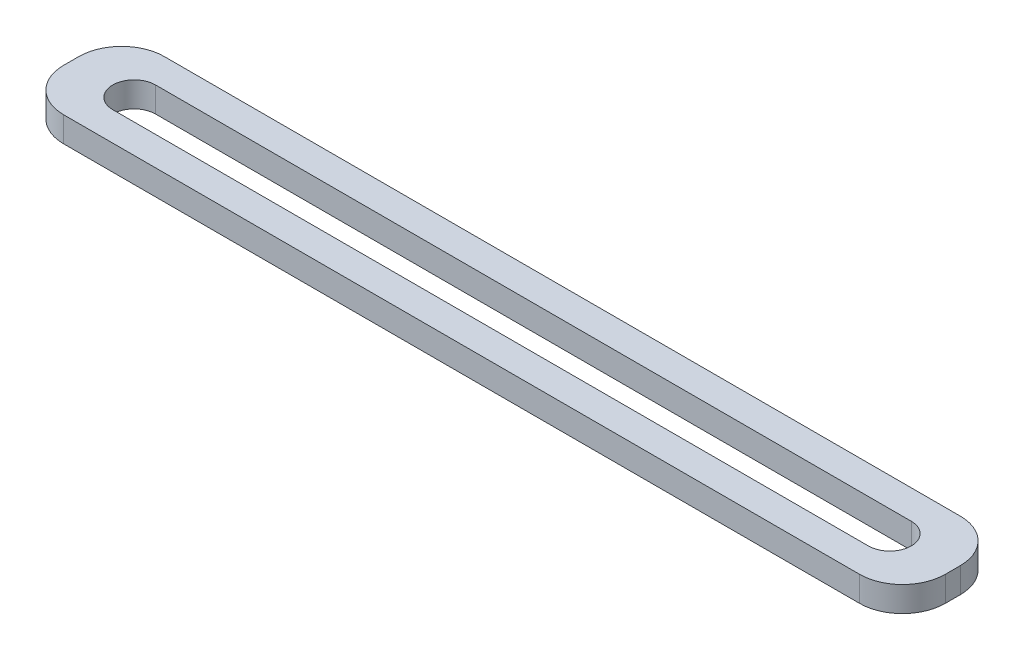
ISO-10303-21;
HEADER;
FILE_DESCRIPTION(('STEP AP214'),'2;1');
FILE_NAME('part.step','',(''),(''),'','','');
FILE_SCHEMA(('AUTOMOTIVE_DESIGN { 1 0 10303 214 1 1 1 1 }'));
ENDSEC;
DATA;
#1=APPLICATION_CONTEXT('core data for automotive mechanical design processes');
#2=APPLICATION_PROTOCOL_DEFINITION('international standard','automotive_design',2000,#1);
#3=PRODUCT_CONTEXT('',#1,'mechanical');
#4=PRODUCT('Part','Part','',(#3));
#5=PRODUCT_RELATED_PRODUCT_CATEGORY('part','',(#4));
#6=PRODUCT_DEFINITION_FORMATION('','',#4);
#7=PRODUCT_DEFINITION_CONTEXT('part definition',#1,'design');
#8=PRODUCT_DEFINITION('design','',#6,#7);
#9=PRODUCT_DEFINITION_SHAPE('','',#8);
#10=(LENGTH_UNIT() NAMED_UNIT(*) SI_UNIT(.MILLI.,.METRE.));
#11=(NAMED_UNIT(*) PLANE_ANGLE_UNIT() SI_UNIT($,.RADIAN.));
#12=(NAMED_UNIT(*) SI_UNIT($,.STERADIAN.) SOLID_ANGLE_UNIT());
#13=UNCERTAINTY_MEASURE_WITH_UNIT(LENGTH_MEASURE(1.E-05),#10,'distance_accuracy_value','');
#14=(GEOMETRIC_REPRESENTATION_CONTEXT(3) GLOBAL_UNCERTAINTY_ASSIGNED_CONTEXT((#13)) GLOBAL_UNIT_ASSIGNED_CONTEXT((#10,
#11,#12)) REPRESENTATION_CONTEXT('',''));
#15=CARTESIAN_POINT('',(0.,0.,0.));
#16=DIRECTION('',(0.,0.,1.));
#17=DIRECTION('',(1.,0.,0.));
#18=AXIS2_PLACEMENT_3D('',#15,#16,#17);
#19=CARTESIAN_POINT('',(35.,2.,1.21430643318376E-13));
#20=DIRECTION('',(1.,0.,0.));
#21=DIRECTION('',(0.,0.,-1.));
#22=AXIS2_PLACEMENT_3D('',#19,#20,#21);
#23=PLANE('',#22);
#24=DIRECTION('',(0.,0.,1.));
#25=VECTOR('',#24,1.);
#26=CARTESIAN_POINT('',(35.,2.,1.21430643318376E-13));
#27=LINE('',#26,#25);
#28=CARTESIAN_POINT('',(35.,2.,-0.599999999999991));
#29=VERTEX_POINT('',#28);
#30=CARTESIAN_POINT('',(35.,2.,0.600000000000012));
#31=VERTEX_POINT('',#30);
#32=EDGE_CURVE('E174',#29,#31,#27,.T.);
#33=ORIENTED_EDGE('',*,*,#32,.T.);
#34=DIRECTION('',(0.,-1.,0.));
#35=VECTOR('',#34,1.);
#36=CARTESIAN_POINT('',(35.,0.,0.600000000000012));
#37=LINE('',#36,#35);
#38=CARTESIAN_POINT('',(35.,0.,0.600000000000012));
#39=VERTEX_POINT('',#38);
#40=EDGE_CURVE('E222',#31,#39,#37,.T.);
#41=ORIENTED_EDGE('',*,*,#40,.T.);
#42=DIRECTION('',(0.,0.,1.));
#43=VECTOR('',#42,1.);
#44=CARTESIAN_POINT('',(35.,0.,1.21430643318376E-13));
#45=LINE('',#44,#43);
#46=CARTESIAN_POINT('',(35.,0.,-0.599999999999991));
#47=VERTEX_POINT('',#46);
#48=EDGE_CURVE('E203',#47,#39,#45,.T.);
#49=ORIENTED_EDGE('',*,*,#48,.F.);
#50=DIRECTION('',(0.,-1.,0.));
#51=VECTOR('',#50,1.);
#52=CARTESIAN_POINT('',(35.,2.,-0.599999999999991));
#53=LINE('',#52,#51);
#54=EDGE_CURVE('E147',#47,#29,#53,.F.);
#55=ORIENTED_EDGE('',*,*,#54,.T.);
#56=EDGE_LOOP('',(#33,#41,#49,#55));
#57=FACE_BOUND('',#56,.T.);
#58=ADVANCED_FACE('F45',(#57),#23,.T.);
#59=CARTESIAN_POINT('',(0.,2.,-4.));
#60=DIRECTION('',(0.,0.,-1.));
#61=DIRECTION('',(-1.,0.,0.));
#62=AXIS2_PLACEMENT_3D('',#59,#60,#61);
#63=PLANE('',#62);
#64=DIRECTION('',(1.,0.,0.));
#65=VECTOR('',#64,1.);
#66=CARTESIAN_POINT('',(0.,2.,-4.));
#67=LINE('',#66,#65);
#68=CARTESIAN_POINT('',(-31.6,2.,-3.99999999999999));
#69=VERTEX_POINT('',#68);
#70=CARTESIAN_POINT('',(31.6,2.,-4.));
#71=VERTEX_POINT('',#70);
#72=EDGE_CURVE('E178',#69,#71,#67,.T.);
#73=ORIENTED_EDGE('',*,*,#72,.T.);
#74=DIRECTION('',(0.,-1.,0.));
#75=VECTOR('',#74,1.);
#76=CARTESIAN_POINT('',(31.6,2.,-4.));
#77=LINE('',#76,#75);
#78=CARTESIAN_POINT('',(31.6,0.,-4.));
#79=VERTEX_POINT('',#78);
#80=EDGE_CURVE('E259',#71,#79,#77,.T.);
#81=ORIENTED_EDGE('',*,*,#80,.T.);
#82=DIRECTION('',(1.,0.,0.));
#83=VECTOR('',#82,1.);
#84=CARTESIAN_POINT('',(0.,0.,-4.));
#85=LINE('',#84,#83);
#86=CARTESIAN_POINT('',(-31.6,0.,-3.99999999999999));
#87=VERTEX_POINT('',#86);
#88=EDGE_CURVE('E207',#87,#79,#85,.T.);
#89=ORIENTED_EDGE('',*,*,#88,.F.);
#90=DIRECTION('',(0.,-1.,0.));
#91=VECTOR('',#90,1.);
#92=CARTESIAN_POINT('',(-31.6,2.,-3.99999999999999));
#93=LINE('',#92,#91);
#94=EDGE_CURVE('E256',#87,#69,#93,.F.);
#95=ORIENTED_EDGE('',*,*,#94,.T.);
#96=EDGE_LOOP('',(#73,#81,#89,#95));
#97=FACE_BOUND('',#96,.T.);
#98=ADVANCED_FACE('F293',(#97),#63,.T.);
#99=CARTESIAN_POINT('',(-35.,2.,0.));
#100=DIRECTION('',(1.,0.,0.));
#101=DIRECTION('',(0.,0.,-1.));
#102=AXIS2_PLACEMENT_3D('',#99,#100,#101);
#103=PLANE('',#102);
#104=DIRECTION('',(0.,0.,1.));
#105=VECTOR('',#104,1.);
#106=CARTESIAN_POINT('',(-35.,0.,0.));
#107=LINE('',#106,#105);
#108=CARTESIAN_POINT('',(-35.,0.,-0.599999999999994));
#109=VERTEX_POINT('',#108);
#110=CARTESIAN_POINT('',(-35.,0.,0.600000000000005));
#111=VERTEX_POINT('',#110);
#112=EDGE_CURVE('E167',#109,#111,#107,.T.);
#113=ORIENTED_EDGE('',*,*,#112,.T.);
#114=DIRECTION('',(0.,-1.,0.));
#115=VECTOR('',#114,1.);
#116=CARTESIAN_POINT('',(-35.,2.,0.600000000000005));
#117=LINE('',#116,#115);
#118=CARTESIAN_POINT('',(-35.,2.,0.600000000000005));
#119=VERTEX_POINT('',#118);
#120=EDGE_CURVE('E11',#111,#119,#117,.F.);
#121=ORIENTED_EDGE('',*,*,#120,.T.);
#122=DIRECTION('',(0.,0.,1.));
#123=VECTOR('',#122,1.);
#124=CARTESIAN_POINT('',(-35.,2.,0.));
#125=LINE('',#124,#123);
#126=CARTESIAN_POINT('',(-35.,2.,-0.599999999999994));
#127=VERTEX_POINT('',#126);
#128=EDGE_CURVE('E182',#127,#119,#125,.T.);
#129=ORIENTED_EDGE('',*,*,#128,.F.);
#130=DIRECTION('',(0.,-1.,0.));
#131=VECTOR('',#130,1.);
#132=CARTESIAN_POINT('',(-35.,0.,-0.599999999999994));
#133=LINE('',#132,#131);
#134=EDGE_CURVE('E54',#127,#109,#133,.T.);
#135=ORIENTED_EDGE('',*,*,#134,.T.);
#136=EDGE_LOOP('',(#113,#121,#129,#135));
#137=FACE_BOUND('',#136,.T.);
#138=ADVANCED_FACE('F266',(#137),#103,.F.);
#139=CARTESIAN_POINT('',(-30.,2.,0.));
#140=DIRECTION('',(0.,-1.,0.));
#141=DIRECTION('',(0.,0.,-1.));
#142=AXIS2_PLACEMENT_3D('',#139,#140,#141);
#143=CYLINDRICAL_SURFACE('',#142,1.7);
#144=CARTESIAN_POINT('',(-30.,0.,0.));
#145=DIRECTION('',(0.,1.,0.));
#146=DIRECTION('',(0.,0.,1.));
#147=AXIS2_PLACEMENT_3D('',#144,#145,#146);
#148=CIRCLE('',#147,1.7);
#149=CARTESIAN_POINT('',(-30.,0.,-1.7));
#150=VERTEX_POINT('',#149);
#151=CARTESIAN_POINT('',(-30.,0.,1.7));
#152=VERTEX_POINT('',#151);
#153=EDGE_CURVE('E142',#150,#152,#148,.T.);
#154=ORIENTED_EDGE('',*,*,#153,.F.);
#155=DIRECTION('',(0.,-1.,0.));
#156=VECTOR('',#155,1.);
#157=CARTESIAN_POINT('',(-30.,2.,-1.7));
#158=LINE('',#157,#156);
#159=CARTESIAN_POINT('',(-30.,2.,-1.7));
#160=VERTEX_POINT('',#159);
#161=EDGE_CURVE('E135',#160,#150,#158,.T.);
#162=ORIENTED_EDGE('',*,*,#161,.F.);
#163=CARTESIAN_POINT('',(-30.,2.,0.));
#164=DIRECTION('',(0.,1.,0.));
#165=DIRECTION('',(0.,0.,1.));
#166=AXIS2_PLACEMENT_3D('',#163,#164,#165);
#167=CIRCLE('',#166,1.7);
#168=CARTESIAN_POINT('',(-30.,2.,1.7));
#169=VERTEX_POINT('',#168);
#170=EDGE_CURVE('E139',#160,#169,#167,.T.);
#171=ORIENTED_EDGE('',*,*,#170,.T.);
#172=DIRECTION('',(0.,-1.,0.));
#173=VECTOR('',#172,1.);
#174=CARTESIAN_POINT('',(-30.,2.,1.7));
#175=LINE('',#174,#173);
#176=EDGE_CURVE('E189',#169,#152,#175,.T.);
#177=ORIENTED_EDGE('',*,*,#176,.T.);
#178=EDGE_LOOP('',(#154,#162,#171,#177));
#179=FACE_BOUND('',#178,.T.);
#180=ADVANCED_FACE('F137',(#179),#143,.F.);
#181=CARTESIAN_POINT('',(0.,2.,-1.7));
#182=DIRECTION('',(0.,0.,-1.));
#183=DIRECTION('',(-1.,0.,0.));
#184=AXIS2_PLACEMENT_3D('',#181,#182,#183);
#185=PLANE('',#184);
#186=DIRECTION('',(1.,0.,0.));
#187=VECTOR('',#186,1.);
#188=CARTESIAN_POINT('',(0.,0.,-1.7));
#189=LINE('',#188,#187);
#190=CARTESIAN_POINT('',(30.,0.,-1.7));
#191=VERTEX_POINT('',#190);
#192=EDGE_CURVE('E192',#150,#191,#189,.T.);
#193=ORIENTED_EDGE('',*,*,#192,.T.);
#194=DIRECTION('',(0.,-1.,0.));
#195=VECTOR('',#194,1.);
#196=CARTESIAN_POINT('',(30.,2.,-1.7));
#197=LINE('',#196,#195);
#198=CARTESIAN_POINT('',(30.,2.,-1.7));
#199=VERTEX_POINT('',#198);
#200=EDGE_CURVE('E148',#199,#191,#197,.T.);
#201=ORIENTED_EDGE('',*,*,#200,.F.);
#202=DIRECTION('',(1.,0.,0.));
#203=VECTOR('',#202,1.);
#204=CARTESIAN_POINT('',(0.,2.,-1.7));
#205=LINE('',#204,#203);
#206=EDGE_CURVE('E151',#160,#199,#205,.T.);
#207=ORIENTED_EDGE('',*,*,#206,.F.);
#208=ORIENTED_EDGE('',*,*,#161,.T.);
#209=EDGE_LOOP('',(#193,#201,#207,#208));
#210=FACE_BOUND('',#209,.T.);
#211=ADVANCED_FACE('F152',(#210),#185,.F.);
#212=CARTESIAN_POINT('',(30.,2.,0.));
#213=DIRECTION('',(0.,-1.,0.));
#214=DIRECTION('',(0.,0.,-1.));
#215=AXIS2_PLACEMENT_3D('',#212,#213,#214);
#216=CYLINDRICAL_SURFACE('',#215,1.70000000000001);
#217=CARTESIAN_POINT('',(30.,0.,0.));
#218=DIRECTION('',(0.,1.,0.));
#219=DIRECTION('',(0.,0.,1.));
#220=AXIS2_PLACEMENT_3D('',#217,#218,#219);
#221=CIRCLE('',#220,1.70000000000001);
#222=CARTESIAN_POINT('',(30.,0.,1.7));
#223=VERTEX_POINT('',#222);
#224=EDGE_CURVE('E195',#223,#191,#221,.T.);
#225=ORIENTED_EDGE('',*,*,#224,.F.);
#226=DIRECTION('',(0.,-1.,0.));
#227=VECTOR('',#226,1.);
#228=CARTESIAN_POINT('',(30.,2.,1.7));
#229=LINE('',#228,#227);
#230=CARTESIAN_POINT('',(30.,2.,1.7));
#231=VERTEX_POINT('',#230);
#232=EDGE_CURVE('E215',#231,#223,#229,.T.);
#233=ORIENTED_EDGE('',*,*,#232,.F.);
#234=CARTESIAN_POINT('',(30.,2.,0.));
#235=DIRECTION('',(0.,1.,0.));
#236=DIRECTION('',(0.,0.,1.));
#237=AXIS2_PLACEMENT_3D('',#234,#235,#236);
#238=CIRCLE('',#237,1.70000000000001);
#239=EDGE_CURVE('E157',#231,#199,#238,.T.);
#240=ORIENTED_EDGE('',*,*,#239,.T.);
#241=ORIENTED_EDGE('',*,*,#200,.T.);
#242=EDGE_LOOP('',(#225,#233,#240,#241));
#243=FACE_BOUND('',#242,.T.);
#244=ADVANCED_FACE('F310',(#243),#216,.F.);
#245=CARTESIAN_POINT('',(0.,2.,1.7));
#246=DIRECTION('',(0.,0.,-1.));
#247=DIRECTION('',(-1.,0.,0.));
#248=AXIS2_PLACEMENT_3D('',#245,#246,#247);
#249=PLANE('',#248);
#250=DIRECTION('',(1.,0.,0.));
#251=VECTOR('',#250,1.);
#252=CARTESIAN_POINT('',(0.,0.,1.7));
#253=LINE('',#252,#251);
#254=EDGE_CURVE('E199',#152,#223,#253,.T.);
#255=ORIENTED_EDGE('',*,*,#254,.F.);
#256=ORIENTED_EDGE('',*,*,#176,.F.);
#257=DIRECTION('',(1.,0.,0.));
#258=VECTOR('',#257,1.);
#259=CARTESIAN_POINT('',(0.,2.,1.7));
#260=LINE('',#259,#258);
#261=EDGE_CURVE('E161',#169,#231,#260,.T.);
#262=ORIENTED_EDGE('',*,*,#261,.T.);
#263=ORIENTED_EDGE('',*,*,#232,.T.);
#264=EDGE_LOOP('',(#255,#256,#262,#263));
#265=FACE_BOUND('',#264,.T.);
#266=ADVANCED_FACE('F307',(#265),#249,.T.);
#267=CARTESIAN_POINT('',(0.,2.,4.));
#268=DIRECTION('',(0.,0.,-1.));
#269=DIRECTION('',(-1.,0.,0.));
#270=AXIS2_PLACEMENT_3D('',#267,#268,#269);
#271=PLANE('',#270);
#272=DIRECTION('',(1.,0.,0.));
#273=VECTOR('',#272,1.);
#274=CARTESIAN_POINT('',(0.,0.,4.));
#275=LINE('',#274,#273);
#276=CARTESIAN_POINT('',(-31.6,0.,4.00000000000001));
#277=VERTEX_POINT('',#276);
#278=CARTESIAN_POINT('',(31.6,0.,4.));
#279=VERTEX_POINT('',#278);
#280=EDGE_CURVE('E163',#277,#279,#275,.T.);
#281=ORIENTED_EDGE('',*,*,#280,.T.);
#282=DIRECTION('',(0.,-1.,0.));
#283=VECTOR('',#282,1.);
#284=CARTESIAN_POINT('',(31.6,2.,4.));
#285=LINE('',#284,#283);
#286=CARTESIAN_POINT('',(31.6,2.,4.));
#287=VERTEX_POINT('',#286);
#288=EDGE_CURVE('E242',#279,#287,#285,.F.);
#289=ORIENTED_EDGE('',*,*,#288,.T.);
#290=DIRECTION('',(1.,0.,0.));
#291=VECTOR('',#290,1.);
#292=CARTESIAN_POINT('',(0.,2.,4.));
#293=LINE('',#292,#291);
#294=CARTESIAN_POINT('',(-31.6,2.,4.00000000000001));
#295=VERTEX_POINT('',#294);
#296=EDGE_CURVE('E185',#295,#287,#293,.T.);
#297=ORIENTED_EDGE('',*,*,#296,.F.);
#298=DIRECTION('',(0.,-1.,0.));
#299=VECTOR('',#298,1.);
#300=CARTESIAN_POINT('',(-31.6,2.,4.00000000000001));
#301=LINE('',#300,#299);
#302=EDGE_CURVE('E238',#295,#277,#301,.T.);
#303=ORIENTED_EDGE('',*,*,#302,.T.);
#304=EDGE_LOOP('',(#281,#289,#297,#303));
#305=FACE_BOUND('',#304,.T.);
#306=ADVANCED_FACE('F278',(#305),#271,.F.);
#307=CARTESIAN_POINT('',(0.,2.,0.));
#308=DIRECTION('',(0.,1.,0.));
#309=DIRECTION('',(0.,0.,1.));
#310=AXIS2_PLACEMENT_3D('',#307,#308,#309);
#311=PLANE('',#310);
#312=ORIENTED_EDGE('',*,*,#170,.F.);
#313=ORIENTED_EDGE('',*,*,#206,.T.);
#314=ORIENTED_EDGE('',*,*,#239,.F.);
#315=ORIENTED_EDGE('',*,*,#261,.F.);
#316=EDGE_LOOP('',(#312,#313,#314,#315));
#317=FACE_BOUND('',#316,.T.);
#318=ORIENTED_EDGE('',*,*,#296,.T.);
#319=CARTESIAN_POINT('',(31.6,2.,0.600000000000001));
#320=DIRECTION('',(0.,1.,0.));
#321=DIRECTION('',(0.,0.,1.));
#322=AXIS2_PLACEMENT_3D('',#319,#320,#321);
#323=CIRCLE('',#322,3.4);
#324=EDGE_CURVE('E253',#287,#31,#323,.T.);
#325=ORIENTED_EDGE('',*,*,#324,.T.);
#326=ORIENTED_EDGE('',*,*,#32,.F.);
#327=CARTESIAN_POINT('',(31.6,2.,-0.600000000000003));
#328=DIRECTION('',(0.,1.,0.));
#329=DIRECTION('',(0.,0.,1.));
#330=AXIS2_PLACEMENT_3D('',#327,#328,#329);
#331=CIRCLE('',#330,3.4);
#332=EDGE_CURVE('E250',#29,#71,#331,.T.);
#333=ORIENTED_EDGE('',*,*,#332,.T.);
#334=ORIENTED_EDGE('',*,*,#72,.F.);
#335=CARTESIAN_POINT('',(-31.6,2.,-0.599999999999994));
#336=DIRECTION('',(0.,1.,0.));
#337=DIRECTION('',(0.,0.,1.));
#338=AXIS2_PLACEMENT_3D('',#335,#336,#337);
#339=CIRCLE('',#338,3.4);
#340=EDGE_CURVE('E66',#69,#127,#339,.T.);
#341=ORIENTED_EDGE('',*,*,#340,.T.);
#342=ORIENTED_EDGE('',*,*,#128,.T.);
#343=CARTESIAN_POINT('',(-31.6,2.,0.600000000000005));
#344=DIRECTION('',(0.,1.,0.));
#345=DIRECTION('',(0.,0.,1.));
#346=AXIS2_PLACEMENT_3D('',#343,#344,#345);
#347=CIRCLE('',#346,3.4);
#348=EDGE_CURVE('E247',#119,#295,#347,.T.);
#349=ORIENTED_EDGE('',*,*,#348,.T.);
#350=EDGE_LOOP('',(#318,#325,#326,#333,#334,#341,#342,#349));
#351=FACE_BOUND('',#350,.T.);
#352=ADVANCED_FACE('F159',(#317,#351),#311,.T.);
#353=CARTESIAN_POINT('',(0.,0.,0.));
#354=DIRECTION('',(0.,1.,0.));
#355=DIRECTION('',(0.,0.,1.));
#356=AXIS2_PLACEMENT_3D('',#353,#354,#355);
#357=PLANE('',#356);
#358=ORIENTED_EDGE('',*,*,#153,.T.);
#359=ORIENTED_EDGE('',*,*,#254,.T.);
#360=ORIENTED_EDGE('',*,*,#224,.T.);
#361=ORIENTED_EDGE('',*,*,#192,.F.);
#362=EDGE_LOOP('',(#358,#359,#360,#361));
#363=FACE_BOUND('',#362,.T.);
#364=ORIENTED_EDGE('',*,*,#48,.T.);
#365=CARTESIAN_POINT('',(31.6,0.,0.600000000000001));
#366=DIRECTION('',(0.,1.,0.));
#367=DIRECTION('',(0.,0.,1.));
#368=AXIS2_PLACEMENT_3D('',#365,#366,#367);
#369=CIRCLE('',#368,3.4);
#370=EDGE_CURVE('E235',#39,#279,#369,.F.);
#371=ORIENTED_EDGE('',*,*,#370,.T.);
#372=ORIENTED_EDGE('',*,*,#280,.F.);
#373=CARTESIAN_POINT('',(-31.6,0.,0.600000000000005));
#374=DIRECTION('',(0.,1.,0.));
#375=DIRECTION('',(0.,0.,1.));
#376=AXIS2_PLACEMENT_3D('',#373,#374,#375);
#377=CIRCLE('',#376,3.4);
#378=EDGE_CURVE('E229',#277,#111,#377,.F.);
#379=ORIENTED_EDGE('',*,*,#378,.T.);
#380=ORIENTED_EDGE('',*,*,#112,.F.);
#381=CARTESIAN_POINT('',(-31.6,0.,-0.599999999999994));
#382=DIRECTION('',(0.,1.,0.));
#383=DIRECTION('',(0.,0.,1.));
#384=AXIS2_PLACEMENT_3D('',#381,#382,#383);
#385=CIRCLE('',#384,3.4);
#386=EDGE_CURVE('E226',#109,#87,#385,.F.);
#387=ORIENTED_EDGE('',*,*,#386,.T.);
#388=ORIENTED_EDGE('',*,*,#88,.T.);
#389=CARTESIAN_POINT('',(31.6,0.,-0.600000000000003));
#390=DIRECTION('',(0.,1.,0.));
#391=DIRECTION('',(0.,0.,1.));
#392=AXIS2_PLACEMENT_3D('',#389,#390,#391);
#393=CIRCLE('',#392,3.4);
#394=EDGE_CURVE('E232',#79,#47,#393,.F.);
#395=ORIENTED_EDGE('',*,*,#394,.T.);
#396=EDGE_LOOP('',(#364,#371,#372,#379,#380,#387,#388,#395));
#397=FACE_BOUND('',#396,.T.);
#398=ADVANCED_FACE('F269',(#363,#397),#357,.F.);
#399=CARTESIAN_POINT('',(31.6,2.,0.600000000000001));
#400=DIRECTION('',(0.,1.,0.));
#401=DIRECTION('',(0.,0.,1.));
#402=AXIS2_PLACEMENT_3D('',#399,#400,#401);
#403=CYLINDRICAL_SURFACE('',#402,3.4);
#404=ORIENTED_EDGE('',*,*,#324,.F.);
#405=ORIENTED_EDGE('',*,*,#288,.F.);
#406=ORIENTED_EDGE('',*,*,#370,.F.);
#407=ORIENTED_EDGE('',*,*,#40,.F.);
#408=EDGE_LOOP('',(#404,#405,#406,#407));
#409=FACE_BOUND('',#408,.T.);
#410=ADVANCED_FACE('F284',(#409),#403,.T.);
#411=CARTESIAN_POINT('',(31.6,2.,-0.600000000000003));
#412=DIRECTION('',(0.,-1.,0.));
#413=DIRECTION('',(0.,0.,-1.));
#414=AXIS2_PLACEMENT_3D('',#411,#412,#413);
#415=CYLINDRICAL_SURFACE('',#414,3.4);
#416=ORIENTED_EDGE('',*,*,#332,.F.);
#417=ORIENTED_EDGE('',*,*,#54,.F.);
#418=ORIENTED_EDGE('',*,*,#394,.F.);
#419=ORIENTED_EDGE('',*,*,#80,.F.);
#420=EDGE_LOOP('',(#416,#417,#418,#419));
#421=FACE_BOUND('',#420,.T.);
#422=ADVANCED_FACE('F291',(#421),#415,.T.);
#423=CARTESIAN_POINT('',(-31.6,2.,0.600000000000005));
#424=DIRECTION('',(0.,-1.,0.));
#425=DIRECTION('',(0.,0.,-1.));
#426=AXIS2_PLACEMENT_3D('',#423,#424,#425);
#427=CYLINDRICAL_SURFACE('',#426,3.4);
#428=ORIENTED_EDGE('',*,*,#348,.F.);
#429=ORIENTED_EDGE('',*,*,#120,.F.);
#430=ORIENTED_EDGE('',*,*,#378,.F.);
#431=ORIENTED_EDGE('',*,*,#302,.F.);
#432=EDGE_LOOP('',(#428,#429,#430,#431));
#433=FACE_BOUND('',#432,.T.);
#434=ADVANCED_FACE('F275',(#433),#427,.T.);
#435=CARTESIAN_POINT('',(-31.6,2.,-0.599999999999994));
#436=DIRECTION('',(0.,1.,0.));
#437=DIRECTION('',(0.,0.,1.));
#438=AXIS2_PLACEMENT_3D('',#435,#436,#437);
#439=CYLINDRICAL_SURFACE('',#438,3.4);
#440=ORIENTED_EDGE('',*,*,#340,.F.);
#441=ORIENTED_EDGE('',*,*,#94,.F.);
#442=ORIENTED_EDGE('',*,*,#386,.F.);
#443=ORIENTED_EDGE('',*,*,#134,.F.);
#444=EDGE_LOOP('',(#440,#441,#442,#443));
#445=FACE_BOUND('',#444,.T.);
#446=ADVANCED_FACE('F47',(#445),#439,.T.);
#447=CLOSED_SHELL('',(#58,#98,#138,#180,#211,#244,#266,#306,#352,#398,#410,#422,#434,#446));
#448=MANIFOLD_SOLID_BREP('B2',#447);
#449=ADVANCED_BREP_SHAPE_REPRESENTATION('',(#18,#448),#14);
#450=SHAPE_DEFINITION_REPRESENTATION(#9,#449);
ENDSEC;
END-ISO-10303-21;
